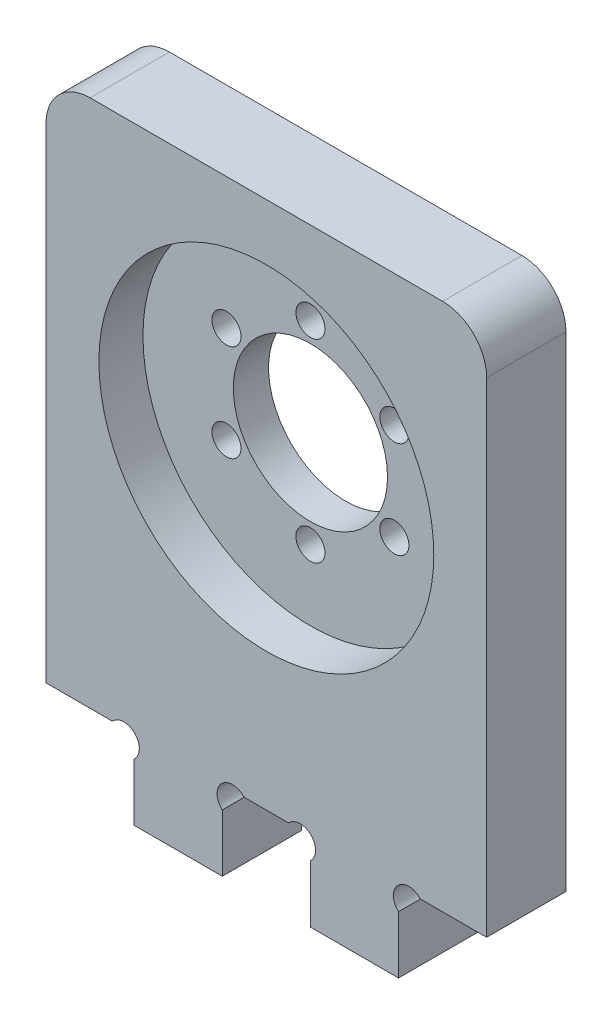
ISO-10303-21;
HEADER;
FILE_DESCRIPTION(('STEP AP214'),'2;1');
FILE_NAME('part.step','',(''),(''),'','','');
FILE_SCHEMA(('AUTOMOTIVE_DESIGN { 1 0 10303 214 1 1 1 1 }'));
ENDSEC;
DATA;
#1=APPLICATION_CONTEXT('core data for automotive mechanical design processes');
#2=APPLICATION_PROTOCOL_DEFINITION('international standard','automotive_design',2000,#1);
#3=PRODUCT_CONTEXT('',#1,'mechanical');
#4=PRODUCT('Part','Part','',(#3));
#5=PRODUCT_RELATED_PRODUCT_CATEGORY('part','',(#4));
#6=PRODUCT_DEFINITION_FORMATION('','',#4);
#7=PRODUCT_DEFINITION_CONTEXT('part definition',#1,'design');
#8=PRODUCT_DEFINITION('design','',#6,#7);
#9=PRODUCT_DEFINITION_SHAPE('','',#8);
#10=(LENGTH_UNIT() NAMED_UNIT(*) SI_UNIT(.MILLI.,.METRE.));
#11=(NAMED_UNIT(*) PLANE_ANGLE_UNIT() SI_UNIT($,.RADIAN.));
#12=(NAMED_UNIT(*) SI_UNIT($,.STERADIAN.) SOLID_ANGLE_UNIT());
#13=UNCERTAINTY_MEASURE_WITH_UNIT(LENGTH_MEASURE(1.E-05),#10,'distance_accuracy_value','');
#14=(GEOMETRIC_REPRESENTATION_CONTEXT(3) GLOBAL_UNCERTAINTY_ASSIGNED_CONTEXT((#13)) GLOBAL_UNIT_ASSIGNED_CONTEXT((#10,
#11,#12)) REPRESENTATION_CONTEXT('',''));
#15=CARTESIAN_POINT('',(0.,0.,0.));
#16=DIRECTION('',(0.,0.,1.));
#17=DIRECTION('',(1.,0.,0.));
#18=AXIS2_PLACEMENT_3D('',#15,#16,#17);
#19=CARTESIAN_POINT('',(25.,34.6,0.));
#20=DIRECTION('',(0.,0.,1.));
#21=DIRECTION('',(1.,0.,0.));
#22=AXIS2_PLACEMENT_3D('',#19,#20,#21);
#23=CYLINDRICAL_SURFACE('',#22,8.75);
#24=CARTESIAN_POINT('',(25.,34.6,0.));
#25=DIRECTION('',(0.,0.,1.));
#26=DIRECTION('',(1.,0.,0.));
#27=AXIS2_PLACEMENT_3D('',#24,#25,#26);
#28=CIRCLE('',#27,8.75);
#29=CARTESIAN_POINT('',(33.75,34.6,0.));
#30=VERTEX_POINT('',#29);
#31=EDGE_CURVE('E190',#30,#30,#28,.T.);
#32=ORIENTED_EDGE('',*,*,#31,.F.);
#33=EDGE_LOOP('',(#32));
#34=FACE_BOUND('',#33,.T.);
#35=CARTESIAN_POINT('',(25.,34.6,4.));
#36=DIRECTION('',(0.,0.,1.));
#37=DIRECTION('',(1.,0.,0.));
#38=AXIS2_PLACEMENT_3D('',#35,#36,#37);
#39=CIRCLE('',#38,8.75);
#40=CARTESIAN_POINT('',(33.75,34.6,4.));
#41=VERTEX_POINT('',#40);
#42=EDGE_CURVE('E309',#41,#41,#39,.F.);
#43=ORIENTED_EDGE('',*,*,#42,.F.);
#44=EDGE_LOOP('',(#43));
#45=FACE_BOUND('',#44,.T.);
#46=ADVANCED_FACE('F33',(#34,#45),#23,.F.);
#47=CARTESIAN_POINT('',(25.,45.6,0.));
#48=DIRECTION('',(0.,0.,1.));
#49=DIRECTION('',(1.,0.,0.));
#50=AXIS2_PLACEMENT_3D('',#47,#48,#49);
#51=CYLINDRICAL_SURFACE('',#50,1.65);
#52=CARTESIAN_POINT('',(25.,45.6,0.));
#53=DIRECTION('',(0.,0.,1.));
#54=DIRECTION('',(1.,0.,0.));
#55=AXIS2_PLACEMENT_3D('',#52,#53,#54);
#56=CIRCLE('',#55,1.65);
#57=CARTESIAN_POINT('',(26.65,45.6,0.));
#58=VERTEX_POINT('',#57);
#59=EDGE_CURVE('E322',#58,#58,#56,.T.);
#60=ORIENTED_EDGE('',*,*,#59,.F.);
#61=EDGE_LOOP('',(#60));
#62=FACE_BOUND('',#61,.T.);
#63=CARTESIAN_POINT('',(25.,45.6,4.));
#64=DIRECTION('',(0.,0.,1.));
#65=DIRECTION('',(1.,0.,0.));
#66=AXIS2_PLACEMENT_3D('',#63,#64,#65);
#67=CIRCLE('',#66,1.65);
#68=CARTESIAN_POINT('',(26.65,45.6,4.));
#69=VERTEX_POINT('',#68);
#70=EDGE_CURVE('E306',#69,#69,#67,.F.);
#71=ORIENTED_EDGE('',*,*,#70,.F.);
#72=EDGE_LOOP('',(#71));
#73=FACE_BOUND('',#72,.T.);
#74=ADVANCED_FACE('F353',(#62,#73),#51,.F.);
#75=CARTESIAN_POINT('',(34.5262794416288,40.1,0.));
#76=DIRECTION('',(0.,0.,1.));
#77=DIRECTION('',(1.,0.,0.));
#78=AXIS2_PLACEMENT_3D('',#75,#76,#77);
#79=CYLINDRICAL_SURFACE('',#78,1.65);
#80=CARTESIAN_POINT('',(34.5262794416288,40.1,0.));
#81=DIRECTION('',(0.,0.,1.));
#82=DIRECTION('',(1.,0.,0.));
#83=AXIS2_PLACEMENT_3D('',#80,#81,#82);
#84=CIRCLE('',#83,1.65);
#85=CARTESIAN_POINT('',(36.1762794416288,40.1,0.));
#86=VERTEX_POINT('',#85);
#87=EDGE_CURVE('E325',#86,#86,#84,.T.);
#88=ORIENTED_EDGE('',*,*,#87,.F.);
#89=EDGE_LOOP('',(#88));
#90=FACE_BOUND('',#89,.T.);
#91=CARTESIAN_POINT('',(34.5262794416288,40.1,4.));
#92=DIRECTION('',(0.,0.,1.));
#93=DIRECTION('',(1.,0.,0.));
#94=AXIS2_PLACEMENT_3D('',#91,#92,#93);
#95=CIRCLE('',#94,1.65);
#96=CARTESIAN_POINT('',(36.1762794416288,40.1,4.));
#97=VERTEX_POINT('',#96);
#98=EDGE_CURVE('E303',#97,#97,#95,.F.);
#99=ORIENTED_EDGE('',*,*,#98,.F.);
#100=EDGE_LOOP('',(#99));
#101=FACE_BOUND('',#100,.T.);
#102=ADVANCED_FACE('F336',(#90,#101),#79,.F.);
#103=CARTESIAN_POINT('',(34.5262794416288,29.1,0.));
#104=DIRECTION('',(0.,0.,1.));
#105=DIRECTION('',(1.,0.,0.));
#106=AXIS2_PLACEMENT_3D('',#103,#104,#105);
#107=CYLINDRICAL_SURFACE('',#106,1.65);
#108=CARTESIAN_POINT('',(34.5262794416288,29.1,0.));
#109=DIRECTION('',(0.,0.,1.));
#110=DIRECTION('',(1.,0.,0.));
#111=AXIS2_PLACEMENT_3D('',#108,#109,#110);
#112=CIRCLE('',#111,1.65);
#113=CARTESIAN_POINT('',(36.1762794416288,29.1,0.));
#114=VERTEX_POINT('',#113);
#115=EDGE_CURVE('E316',#114,#114,#112,.T.);
#116=ORIENTED_EDGE('',*,*,#115,.F.);
#117=EDGE_LOOP('',(#116));
#118=FACE_BOUND('',#117,.T.);
#119=CARTESIAN_POINT('',(34.5262794416288,29.1,4.));
#120=DIRECTION('',(0.,0.,1.));
#121=DIRECTION('',(1.,0.,0.));
#122=AXIS2_PLACEMENT_3D('',#119,#120,#121);
#123=CIRCLE('',#122,1.65);
#124=CARTESIAN_POINT('',(36.1762794416288,29.1,4.));
#125=VERTEX_POINT('',#124);
#126=EDGE_CURVE('E300',#125,#125,#123,.F.);
#127=ORIENTED_EDGE('',*,*,#126,.F.);
#128=EDGE_LOOP('',(#127));
#129=FACE_BOUND('',#128,.T.);
#130=ADVANCED_FACE('F332',(#118,#129),#107,.F.);
#131=CARTESIAN_POINT('',(25.,23.6,0.));
#132=DIRECTION('',(0.,0.,1.));
#133=DIRECTION('',(1.,0.,0.));
#134=AXIS2_PLACEMENT_3D('',#131,#132,#133);
#135=CYLINDRICAL_SURFACE('',#134,1.65);
#136=CARTESIAN_POINT('',(25.,23.6,0.));
#137=DIRECTION('',(0.,0.,1.));
#138=DIRECTION('',(1.,0.,0.));
#139=AXIS2_PLACEMENT_3D('',#136,#137,#138);
#140=CIRCLE('',#139,1.65);
#141=CARTESIAN_POINT('',(26.65,23.6,0.));
#142=VERTEX_POINT('',#141);
#143=EDGE_CURVE('E313',#142,#142,#140,.T.);
#144=ORIENTED_EDGE('',*,*,#143,.F.);
#145=EDGE_LOOP('',(#144));
#146=FACE_BOUND('',#145,.T.);
#147=CARTESIAN_POINT('',(25.,23.6,4.));
#148=DIRECTION('',(0.,0.,1.));
#149=DIRECTION('',(1.,0.,0.));
#150=AXIS2_PLACEMENT_3D('',#147,#148,#149);
#151=CIRCLE('',#150,1.65);
#152=CARTESIAN_POINT('',(26.65,23.6,4.));
#153=VERTEX_POINT('',#152);
#154=EDGE_CURVE('E297',#153,#153,#151,.F.);
#155=ORIENTED_EDGE('',*,*,#154,.F.);
#156=EDGE_LOOP('',(#155));
#157=FACE_BOUND('',#156,.T.);
#158=ADVANCED_FACE('F335',(#146,#157),#135,.F.);
#159=CARTESIAN_POINT('',(15.4737205583712,29.1,0.));
#160=DIRECTION('',(0.,0.,1.));
#161=DIRECTION('',(1.,0.,0.));
#162=AXIS2_PLACEMENT_3D('',#159,#160,#161);
#163=CYLINDRICAL_SURFACE('',#162,1.65);
#164=CARTESIAN_POINT('',(15.4737205583712,29.1,0.));
#165=DIRECTION('',(0.,0.,1.));
#166=DIRECTION('',(1.,0.,0.));
#167=AXIS2_PLACEMENT_3D('',#164,#165,#166);
#168=CIRCLE('',#167,1.65);
#169=CARTESIAN_POINT('',(17.1237205583712,29.1,0.));
#170=VERTEX_POINT('',#169);
#171=EDGE_CURVE('E317',#170,#170,#168,.T.);
#172=ORIENTED_EDGE('',*,*,#171,.F.);
#173=EDGE_LOOP('',(#172));
#174=FACE_BOUND('',#173,.T.);
#175=CARTESIAN_POINT('',(15.4737205583712,29.1,4.));
#176=DIRECTION('',(0.,0.,1.));
#177=DIRECTION('',(1.,0.,0.));
#178=AXIS2_PLACEMENT_3D('',#175,#176,#177);
#179=CIRCLE('',#178,1.65);
#180=CARTESIAN_POINT('',(17.1237205583712,29.1,4.));
#181=VERTEX_POINT('',#180);
#182=EDGE_CURVE('E257',#181,#181,#179,.F.);
#183=ORIENTED_EDGE('',*,*,#182,.F.);
#184=EDGE_LOOP('',(#183));
#185=FACE_BOUND('',#184,.T.);
#186=ADVANCED_FACE('F485',(#174,#185),#163,.F.);
#187=CARTESIAN_POINT('',(15.4737205583712,40.1,0.));
#188=DIRECTION('',(0.,0.,1.));
#189=DIRECTION('',(1.,0.,0.));
#190=AXIS2_PLACEMENT_3D('',#187,#188,#189);
#191=CYLINDRICAL_SURFACE('',#190,1.65);
#192=CARTESIAN_POINT('',(15.4737205583712,40.1,0.));
#193=DIRECTION('',(0.,0.,1.));
#194=DIRECTION('',(1.,0.,0.));
#195=AXIS2_PLACEMENT_3D('',#192,#193,#194);
#196=CIRCLE('',#195,1.65);
#197=CARTESIAN_POINT('',(17.1237205583712,40.1,0.));
#198=VERTEX_POINT('',#197);
#199=EDGE_CURVE('E312',#198,#198,#196,.T.);
#200=ORIENTED_EDGE('',*,*,#199,.F.);
#201=EDGE_LOOP('',(#200));
#202=FACE_BOUND('',#201,.T.);
#203=CARTESIAN_POINT('',(15.4737205583712,40.1,4.));
#204=DIRECTION('',(0.,0.,1.));
#205=DIRECTION('',(1.,0.,0.));
#206=AXIS2_PLACEMENT_3D('',#203,#204,#205);
#207=CIRCLE('',#206,1.65);
#208=CARTESIAN_POINT('',(17.1237205583712,40.1,4.));
#209=VERTEX_POINT('',#208);
#210=EDGE_CURVE('E254',#209,#209,#207,.F.);
#211=ORIENTED_EDGE('',*,*,#210,.F.);
#212=EDGE_LOOP('',(#211));
#213=FACE_BOUND('',#212,.T.);
#214=ADVANCED_FACE('F489',(#202,#213),#191,.F.);
#215=CARTESIAN_POINT('',(0.,0.,9.));
#216=DIRECTION('',(0.,1.,0.));
#217=DIRECTION('',(0.,0.,1.));
#218=AXIS2_PLACEMENT_3D('',#215,#216,#217);
#219=PLANE('',#218);
#220=DIRECTION('',(1.,0.,0.));
#221=VECTOR('',#220,1.);
#222=CARTESIAN_POINT('',(0.,0.,9.));
#223=LINE('',#222,#221);
#224=CARTESIAN_POINT('',(22.4748737341529,0.,9.));
#225=VERTEX_POINT('',#224);
#226=CARTESIAN_POINT('',(27.5251262658471,0.,9.));
#227=VERTEX_POINT('',#226);
#228=EDGE_CURVE('E228',#225,#227,#223,.T.);
#229=ORIENTED_EDGE('',*,*,#228,.F.);
#230=DIRECTION('',(0.,0.,1.));
#231=VECTOR('',#230,1.);
#232=CARTESIAN_POINT('',(22.4748737341529,0.,0.));
#233=LINE('',#232,#231);
#234=CARTESIAN_POINT('',(22.4748737341529,0.,0.));
#235=VERTEX_POINT('',#234);
#236=EDGE_CURVE('E287',#235,#225,#233,.T.);
#237=ORIENTED_EDGE('',*,*,#236,.F.);
#238=DIRECTION('',(1.,0.,0.));
#239=VECTOR('',#238,1.);
#240=CARTESIAN_POINT('',(0.,0.,0.));
#241=LINE('',#240,#239);
#242=CARTESIAN_POINT('',(27.5251262658471,0.,0.));
#243=VERTEX_POINT('',#242);
#244=EDGE_CURVE('E243',#235,#243,#241,.T.);
#245=ORIENTED_EDGE('',*,*,#244,.T.);
#246=DIRECTION('',(0.,0.,1.));
#247=VECTOR('',#246,1.);
#248=CARTESIAN_POINT('',(27.5251262658471,0.,0.));
#249=LINE('',#248,#247);
#250=EDGE_CURVE('E280',#243,#227,#249,.T.);
#251=ORIENTED_EDGE('',*,*,#250,.T.);
#252=EDGE_LOOP('',(#229,#237,#245,#251));
#253=FACE_BOUND('',#252,.T.);
#254=ADVANCED_FACE('F406',(#253),#219,.F.);
#255=CARTESIAN_POINT('',(42.4748737341529,0.,9.));
#256=VERTEX_POINT('',#255);
#257=CARTESIAN_POINT('',(50.,0.,9.));
#258=VERTEX_POINT('',#257);
#259=EDGE_CURVE('E226',#256,#258,#223,.T.);
#260=ORIENTED_EDGE('',*,*,#259,.F.);
#261=DIRECTION('',(0.,0.,1.));
#262=VECTOR('',#261,1.);
#263=CARTESIAN_POINT('',(42.4748737341529,0.,0.));
#264=LINE('',#263,#262);
#265=CARTESIAN_POINT('',(42.4748737341529,0.,0.));
#266=VERTEX_POINT('',#265);
#267=EDGE_CURVE('E460',#266,#256,#264,.T.);
#268=ORIENTED_EDGE('',*,*,#267,.F.);
#269=CARTESIAN_POINT('',(50.,0.,0.));
#270=VERTEX_POINT('',#269);
#271=EDGE_CURVE('E239',#266,#270,#241,.T.);
#272=ORIENTED_EDGE('',*,*,#271,.T.);
#273=DIRECTION('',(0.,0.,-1.));
#274=VECTOR('',#273,1.);
#275=CARTESIAN_POINT('',(50.,0.,9.));
#276=LINE('',#275,#274);
#277=EDGE_CURVE('E237',#258,#270,#276,.T.);
#278=ORIENTED_EDGE('',*,*,#277,.F.);
#279=EDGE_LOOP('',(#260,#268,#272,#278));
#280=FACE_BOUND('',#279,.T.);
#281=ADVANCED_FACE('F407',(#280),#219,.F.);
#282=CARTESIAN_POINT('',(0.,0.,9.));
#283=DIRECTION('',(1.,0.,0.));
#284=DIRECTION('',(0.,0.,-1.));
#285=AXIS2_PLACEMENT_3D('',#282,#283,#284);
#286=PLANE('',#285);
#287=DIRECTION('',(0.,-1.,0.));
#288=VECTOR('',#287,1.);
#289=CARTESIAN_POINT('',(0.,0.,9.));
#290=LINE('',#289,#288);
#291=CARTESIAN_POINT('',(0.,55.,9.));
#292=VERTEX_POINT('',#291);
#293=CARTESIAN_POINT('',(0.,0.,9.));
#294=VERTEX_POINT('',#293);
#295=EDGE_CURVE('E224',#292,#294,#290,.T.);
#296=ORIENTED_EDGE('',*,*,#295,.F.);
#297=DIRECTION('',(0.,0.,-1.));
#298=VECTOR('',#297,1.);
#299=CARTESIAN_POINT('',(0.,55.,9.));
#300=LINE('',#299,#298);
#301=CARTESIAN_POINT('',(0.,55.,0.));
#302=VERTEX_POINT('',#301);
#303=EDGE_CURVE('E11',#292,#302,#300,.T.);
#304=ORIENTED_EDGE('',*,*,#303,.T.);
#305=DIRECTION('',(0.,-1.,0.));
#306=VECTOR('',#305,1.);
#307=CARTESIAN_POINT('',(0.,0.,0.));
#308=LINE('',#307,#306);
#309=CARTESIAN_POINT('',(0.,0.,0.));
#310=VERTEX_POINT('',#309);
#311=EDGE_CURVE('E221',#302,#310,#308,.T.);
#312=ORIENTED_EDGE('',*,*,#311,.T.);
#313=DIRECTION('',(0.,0.,-1.));
#314=VECTOR('',#313,1.);
#315=CARTESIAN_POINT('',(0.,0.,9.));
#316=LINE('',#315,#314);
#317=EDGE_CURVE('E250',#294,#310,#316,.T.);
#318=ORIENTED_EDGE('',*,*,#317,.F.);
#319=EDGE_LOOP('',(#296,#304,#312,#318));
#320=FACE_BOUND('',#319,.T.);
#321=ADVANCED_FACE('F404',(#320),#286,.F.);
#322=CARTESIAN_POINT('',(7.52512626584709,0.,0.));
#323=VERTEX_POINT('',#322);
#324=EDGE_CURVE('E240',#310,#323,#241,.T.);
#325=ORIENTED_EDGE('',*,*,#324,.T.);
#326=DIRECTION('',(0.,0.,1.));
#327=VECTOR('',#326,1.);
#328=CARTESIAN_POINT('',(7.52512626584709,0.,0.));
#329=LINE('',#328,#327);
#330=CARTESIAN_POINT('',(7.5251262658471,0.,9.));
#331=VERTEX_POINT('',#330);
#332=EDGE_CURVE('E161',#323,#331,#329,.T.);
#333=ORIENTED_EDGE('',*,*,#332,.T.);
#334=EDGE_CURVE('E230',#294,#331,#223,.T.);
#335=ORIENTED_EDGE('',*,*,#334,.F.);
#336=ORIENTED_EDGE('',*,*,#317,.T.);
#337=EDGE_LOOP('',(#325,#333,#335,#336));
#338=FACE_BOUND('',#337,.T.);
#339=ADVANCED_FACE('F400',(#338),#219,.F.);
#340=CARTESIAN_POINT('',(50.,0.,9.));
#341=DIRECTION('',(-1.,0.,0.));
#342=DIRECTION('',(0.,0.,1.));
#343=AXIS2_PLACEMENT_3D('',#340,#341,#342);
#344=PLANE('',#343);
#345=DIRECTION('',(0.,1.,0.));
#346=VECTOR('',#345,1.);
#347=CARTESIAN_POINT('',(50.,0.,0.));
#348=LINE('',#347,#346);
#349=CARTESIAN_POINT('',(50.,55.,0.));
#350=VERTEX_POINT('',#349);
#351=EDGE_CURVE('E242',#270,#350,#348,.T.);
#352=ORIENTED_EDGE('',*,*,#351,.T.);
#353=DIRECTION('',(0.,0.,-1.));
#354=VECTOR('',#353,1.);
#355=CARTESIAN_POINT('',(50.,55.,9.));
#356=LINE('',#355,#354);
#357=CARTESIAN_POINT('',(50.,55.,9.));
#358=VERTEX_POINT('',#357);
#359=EDGE_CURVE('E267',#350,#358,#356,.F.);
#360=ORIENTED_EDGE('',*,*,#359,.T.);
#361=DIRECTION('',(0.,1.,0.));
#362=VECTOR('',#361,1.);
#363=CARTESIAN_POINT('',(50.,0.,9.));
#364=LINE('',#363,#362);
#365=EDGE_CURVE('E231',#258,#358,#364,.T.);
#366=ORIENTED_EDGE('',*,*,#365,.F.);
#367=ORIENTED_EDGE('',*,*,#277,.T.);
#368=EDGE_LOOP('',(#352,#360,#366,#367));
#369=FACE_BOUND('',#368,.T.);
#370=ADVANCED_FACE('F396',(#369),#344,.F.);
#371=CARTESIAN_POINT('',(0.,60.,9.));
#372=DIRECTION('',(0.,-1.,0.));
#373=DIRECTION('',(0.,0.,-1.));
#374=AXIS2_PLACEMENT_3D('',#371,#372,#373);
#375=PLANE('',#374);
#376=DIRECTION('',(-1.,0.,0.));
#377=VECTOR('',#376,1.);
#378=CARTESIAN_POINT('',(0.,60.,9.));
#379=LINE('',#378,#377);
#380=CARTESIAN_POINT('',(45.,60.,9.));
#381=VERTEX_POINT('',#380);
#382=CARTESIAN_POINT('',(5.,60.,9.));
#383=VERTEX_POINT('',#382);
#384=EDGE_CURVE('E234',#381,#383,#379,.T.);
#385=ORIENTED_EDGE('',*,*,#384,.F.);
#386=DIRECTION('',(0.,0.,-1.));
#387=VECTOR('',#386,1.);
#388=CARTESIAN_POINT('',(45.,60.,9.));
#389=LINE('',#388,#387);
#390=CARTESIAN_POINT('',(45.,60.,0.));
#391=VERTEX_POINT('',#390);
#392=EDGE_CURVE('E260',#381,#391,#389,.T.);
#393=ORIENTED_EDGE('',*,*,#392,.T.);
#394=DIRECTION('',(-1.,0.,0.));
#395=VECTOR('',#394,1.);
#396=CARTESIAN_POINT('',(0.,60.,0.));
#397=LINE('',#396,#395);
#398=CARTESIAN_POINT('',(5.,60.,0.));
#399=VERTEX_POINT('',#398);
#400=EDGE_CURVE('E227',#391,#399,#397,.T.);
#401=ORIENTED_EDGE('',*,*,#400,.T.);
#402=DIRECTION('',(0.,0.,-1.));
#403=VECTOR('',#402,1.);
#404=CARTESIAN_POINT('',(5.,60.,9.));
#405=LINE('',#404,#403);
#406=EDGE_CURVE('E253',#399,#383,#405,.F.);
#407=ORIENTED_EDGE('',*,*,#406,.T.);
#408=EDGE_LOOP('',(#385,#393,#401,#407));
#409=FACE_BOUND('',#408,.T.);
#410=ADVANCED_FACE('F390',(#409),#375,.F.);
#411=CARTESIAN_POINT('',(0.,0.,9.));
#412=DIRECTION('',(0.,0.,-1.));
#413=DIRECTION('',(-1.,0.,0.));
#414=AXIS2_PLACEMENT_3D('',#411,#412,#413);
#415=PLANE('',#414);
#416=CARTESIAN_POINT('',(25.,34.6,9.));
#417=DIRECTION('',(0.,0.,1.));
#418=DIRECTION('',(1.,0.,0.));
#419=AXIS2_PLACEMENT_3D('',#416,#417,#418);
#420=CIRCLE('',#419,19.);
#421=CARTESIAN_POINT('',(44.,34.6,9.));
#422=VERTEX_POINT('',#421);
#423=EDGE_CURVE('E275',#422,#422,#420,.T.);
#424=ORIENTED_EDGE('',*,*,#423,.F.);
#425=EDGE_LOOP('',(#424));
#426=FACE_BOUND('',#425,.T.);
#427=ORIENTED_EDGE('',*,*,#334,.T.);
#428=CARTESIAN_POINT('',(8.8313627116336,-1.16863728836642,9.));
#429=DIRECTION('',(0.,0.,1.));
#430=DIRECTION('',(1.,0.,0.));
#431=AXIS2_PLACEMENT_3D('',#428,#429,#430);
#432=CIRCLE('',#431,1.7527027027027);
#433=CARTESIAN_POINT('',(10.,-2.47487373415292,9.));
#434=VERTEX_POINT('',#433);
#435=EDGE_CURVE('E37',#434,#331,#432,.T.);
#436=ORIENTED_EDGE('',*,*,#435,.F.);
#437=DIRECTION('',(0.,-1.,0.));
#438=VECTOR('',#437,1.);
#439=CARTESIAN_POINT('',(10.,0.,9.));
#440=LINE('',#439,#438);
#441=CARTESIAN_POINT('',(10.,-9.,9.));
#442=VERTEX_POINT('',#441);
#443=EDGE_CURVE('E173',#434,#442,#440,.T.);
#444=ORIENTED_EDGE('',*,*,#443,.T.);
#445=DIRECTION('',(1.,0.,0.));
#446=VECTOR('',#445,1.);
#447=CARTESIAN_POINT('',(20.,-9.,9.));
#448=LINE('',#447,#446);
#449=CARTESIAN_POINT('',(20.,-9.,9.));
#450=VERTEX_POINT('',#449);
#451=EDGE_CURVE('E187',#442,#450,#448,.T.);
#452=ORIENTED_EDGE('',*,*,#451,.T.);
#453=DIRECTION('',(0.,1.,0.));
#454=VECTOR('',#453,1.);
#455=CARTESIAN_POINT('',(20.,0.,9.));
#456=LINE('',#455,#454);
#457=CARTESIAN_POINT('',(20.,-2.47487373415292,9.));
#458=VERTEX_POINT('',#457);
#459=EDGE_CURVE('E182',#450,#458,#456,.T.);
#460=ORIENTED_EDGE('',*,*,#459,.T.);
#461=CARTESIAN_POINT('',(21.1686372883664,-1.16863728836642,9.));
#462=DIRECTION('',(0.,0.,1.));
#463=DIRECTION('',(1.,0.,0.));
#464=AXIS2_PLACEMENT_3D('',#461,#462,#463);
#465=CIRCLE('',#464,1.7527027027027);
#466=EDGE_CURVE('E277',#225,#458,#465,.T.);
#467=ORIENTED_EDGE('',*,*,#466,.F.);
#468=ORIENTED_EDGE('',*,*,#228,.T.);
#469=CARTESIAN_POINT('',(28.8313627116336,-1.16863728836642,9.));
#470=DIRECTION('',(0.,0.,1.));
#471=DIRECTION('',(1.,0.,0.));
#472=AXIS2_PLACEMENT_3D('',#469,#470,#471);
#473=CIRCLE('',#472,1.7527027027027);
#474=CARTESIAN_POINT('',(30.,-2.47487373415292,9.));
#475=VERTEX_POINT('',#474);
#476=EDGE_CURVE('E272',#475,#227,#473,.T.);
#477=ORIENTED_EDGE('',*,*,#476,.F.);
#478=DIRECTION('',(0.,-1.,0.));
#479=VECTOR('',#478,1.);
#480=CARTESIAN_POINT('',(30.,0.,9.));
#481=LINE('',#480,#479);
#482=CARTESIAN_POINT('',(30.,-9.,9.));
#483=VERTEX_POINT('',#482);
#484=EDGE_CURVE('E201',#475,#483,#481,.T.);
#485=ORIENTED_EDGE('',*,*,#484,.T.);
#486=DIRECTION('',(1.,0.,0.));
#487=VECTOR('',#486,1.);
#488=CARTESIAN_POINT('',(30.,-9.,9.));
#489=LINE('',#488,#487);
#490=CARTESIAN_POINT('',(40.,-9.,9.));
#491=VERTEX_POINT('',#490);
#492=EDGE_CURVE('E214',#483,#491,#489,.T.);
#493=ORIENTED_EDGE('',*,*,#492,.T.);
#494=DIRECTION('',(0.,1.,0.));
#495=VECTOR('',#494,1.);
#496=CARTESIAN_POINT('',(40.,0.,9.));
#497=LINE('',#496,#495);
#498=CARTESIAN_POINT('',(40.,-2.47487373415292,9.));
#499=VERTEX_POINT('',#498);
#500=EDGE_CURVE('E206',#491,#499,#497,.T.);
#501=ORIENTED_EDGE('',*,*,#500,.T.);
#502=CARTESIAN_POINT('',(41.1686372883664,-1.16863728836642,9.));
#503=DIRECTION('',(0.,0.,1.));
#504=DIRECTION('',(1.,0.,0.));
#505=AXIS2_PLACEMENT_3D('',#502,#503,#504);
#506=CIRCLE('',#505,1.7527027027027);
#507=EDGE_CURVE('E52',#256,#499,#506,.T.);
#508=ORIENTED_EDGE('',*,*,#507,.F.);
#509=ORIENTED_EDGE('',*,*,#259,.T.);
#510=ORIENTED_EDGE('',*,*,#365,.T.);
#511=CARTESIAN_POINT('',(45.,55.,9.));
#512=DIRECTION('',(0.,0.,-1.));
#513=DIRECTION('',(-1.,0.,0.));
#514=AXIS2_PLACEMENT_3D('',#511,#512,#513);
#515=CIRCLE('',#514,5.);
#516=EDGE_CURVE('E43',#358,#381,#515,.F.);
#517=ORIENTED_EDGE('',*,*,#516,.T.);
#518=ORIENTED_EDGE('',*,*,#384,.T.);
#519=CARTESIAN_POINT('',(5.,55.,9.));
#520=DIRECTION('',(0.,0.,-1.));
#521=DIRECTION('',(-1.,0.,0.));
#522=AXIS2_PLACEMENT_3D('',#519,#520,#521);
#523=CIRCLE('',#522,5.);
#524=EDGE_CURVE('E269',#383,#292,#523,.F.);
#525=ORIENTED_EDGE('',*,*,#524,.T.);
#526=ORIENTED_EDGE('',*,*,#295,.T.);
#527=EDGE_LOOP('',(#427,#436,#444,#452,#460,#467,#468,#477,#485,#493,#501,#508,#509,#510,#517,
#518,#525,#526));
#528=FACE_BOUND('',#527,.T.);
#529=ADVANCED_FACE('F387',(#426,#528),#415,.F.);
#530=CARTESIAN_POINT('',(0.,0.,0.));
#531=DIRECTION('',(0.,0.,-1.));
#532=DIRECTION('',(-1.,0.,0.));
#533=AXIS2_PLACEMENT_3D('',#530,#531,#532);
#534=PLANE('',#533);
#535=CARTESIAN_POINT('',(8.8313627116336,-1.16863728836642,0.));
#536=DIRECTION('',(0.,0.,1.));
#537=DIRECTION('',(-1.,0.,0.));
#538=AXIS2_PLACEMENT_3D('',#535,#536,#537);
#539=CIRCLE('',#538,1.7527027027027);
#540=CARTESIAN_POINT('',(10.,-2.47487373415292,0.));
#541=VERTEX_POINT('',#540);
#542=EDGE_CURVE('E158',#541,#323,#539,.T.);
#543=ORIENTED_EDGE('',*,*,#542,.T.);
#544=ORIENTED_EDGE('',*,*,#324,.F.);
#545=ORIENTED_EDGE('',*,*,#311,.F.);
#546=CARTESIAN_POINT('',(5.,55.,0.));
#547=DIRECTION('',(0.,0.,-1.));
#548=DIRECTION('',(-1.,0.,0.));
#549=AXIS2_PLACEMENT_3D('',#546,#547,#548);
#550=CIRCLE('',#549,5.);
#551=EDGE_CURVE('E263',#302,#399,#550,.T.);
#552=ORIENTED_EDGE('',*,*,#551,.T.);
#553=ORIENTED_EDGE('',*,*,#400,.F.);
#554=CARTESIAN_POINT('',(45.,55.,0.));
#555=DIRECTION('',(0.,0.,-1.));
#556=DIRECTION('',(-1.,0.,0.));
#557=AXIS2_PLACEMENT_3D('',#554,#555,#556);
#558=CIRCLE('',#557,5.);
#559=EDGE_CURVE('E265',#391,#350,#558,.T.);
#560=ORIENTED_EDGE('',*,*,#559,.T.);
#561=ORIENTED_EDGE('',*,*,#351,.F.);
#562=ORIENTED_EDGE('',*,*,#271,.F.);
#563=CARTESIAN_POINT('',(41.1686372883664,-1.16863728836642,0.));
#564=DIRECTION('',(0.,0.,1.));
#565=DIRECTION('',(1.,0.,0.));
#566=AXIS2_PLACEMENT_3D('',#563,#564,#565);
#567=CIRCLE('',#566,1.7527027027027);
#568=CARTESIAN_POINT('',(40.,-2.47487373415292,0.));
#569=VERTEX_POINT('',#568);
#570=EDGE_CURVE('E174',#266,#569,#567,.T.);
#571=ORIENTED_EDGE('',*,*,#570,.T.);
#572=DIRECTION('',(0.,1.,0.));
#573=VECTOR('',#572,1.);
#574=CARTESIAN_POINT('',(40.,0.,0.));
#575=LINE('',#574,#573);
#576=CARTESIAN_POINT('',(40.,-9.,0.));
#577=VERTEX_POINT('',#576);
#578=EDGE_CURVE('E209',#577,#569,#575,.T.);
#579=ORIENTED_EDGE('',*,*,#578,.F.);
#580=DIRECTION('',(1.,0.,0.));
#581=VECTOR('',#580,1.);
#582=CARTESIAN_POINT('',(30.,-9.,0.));
#583=LINE('',#582,#581);
#584=CARTESIAN_POINT('',(30.,-9.,0.));
#585=VERTEX_POINT('',#584);
#586=EDGE_CURVE('E205',#585,#577,#583,.T.);
#587=ORIENTED_EDGE('',*,*,#586,.F.);
#588=DIRECTION('',(0.,-1.,0.));
#589=VECTOR('',#588,1.);
#590=CARTESIAN_POINT('',(30.,0.,0.));
#591=LINE('',#590,#589);
#592=CARTESIAN_POINT('',(30.,-2.47487373415292,0.));
#593=VERTEX_POINT('',#592);
#594=EDGE_CURVE('E203',#593,#585,#591,.T.);
#595=ORIENTED_EDGE('',*,*,#594,.F.);
#596=CARTESIAN_POINT('',(28.8313627116336,-1.16863728836642,0.));
#597=DIRECTION('',(0.,0.,1.));
#598=DIRECTION('',(-1.,0.,0.));
#599=AXIS2_PLACEMENT_3D('',#596,#597,#598);
#600=CIRCLE('',#599,1.7527027027027);
#601=EDGE_CURVE('E278',#593,#243,#600,.T.);
#602=ORIENTED_EDGE('',*,*,#601,.T.);
#603=ORIENTED_EDGE('',*,*,#244,.F.);
#604=CARTESIAN_POINT('',(21.1686372883664,-1.16863728836642,0.));
#605=DIRECTION('',(0.,0.,1.));
#606=DIRECTION('',(1.,0.,0.));
#607=AXIS2_PLACEMENT_3D('',#604,#605,#606);
#608=CIRCLE('',#607,1.7527027027027);
#609=CARTESIAN_POINT('',(20.,-2.47487373415292,0.));
#610=VERTEX_POINT('',#609);
#611=EDGE_CURVE('E79',#235,#610,#608,.T.);
#612=ORIENTED_EDGE('',*,*,#611,.T.);
#613=DIRECTION('',(0.,1.,0.));
#614=VECTOR('',#613,1.);
#615=CARTESIAN_POINT('',(20.,0.,0.));
#616=LINE('',#615,#614);
#617=CARTESIAN_POINT('',(20.,-9.,0.));
#618=VERTEX_POINT('',#617);
#619=EDGE_CURVE('E184',#618,#610,#616,.T.);
#620=ORIENTED_EDGE('',*,*,#619,.F.);
#621=DIRECTION('',(1.,0.,0.));
#622=VECTOR('',#621,1.);
#623=CARTESIAN_POINT('',(20.,-9.,0.));
#624=LINE('',#623,#622);
#625=CARTESIAN_POINT('',(10.,-9.,0.));
#626=VERTEX_POINT('',#625);
#627=EDGE_CURVE('E181',#626,#618,#624,.T.);
#628=ORIENTED_EDGE('',*,*,#627,.F.);
#629=DIRECTION('',(0.,-1.,0.));
#630=VECTOR('',#629,1.);
#631=CARTESIAN_POINT('',(10.,0.,0.));
#632=LINE('',#631,#630);
#633=EDGE_CURVE('E171',#541,#626,#632,.T.);
#634=ORIENTED_EDGE('',*,*,#633,.F.);
#635=EDGE_LOOP('',(#543,#544,#545,#552,#553,#560,#561,#562,#571,#579,#587,#595,#602,#603,#612,
#620,#628,#634));
#636=FACE_BOUND('',#635,.T.);
#637=ORIENTED_EDGE('',*,*,#199,.T.);
#638=EDGE_LOOP('',(#637));
#639=FACE_BOUND('',#638,.T.);
#640=ORIENTED_EDGE('',*,*,#171,.T.);
#641=EDGE_LOOP('',(#640));
#642=FACE_BOUND('',#641,.T.);
#643=ORIENTED_EDGE('',*,*,#143,.T.);
#644=EDGE_LOOP('',(#643));
#645=FACE_BOUND('',#644,.T.);
#646=ORIENTED_EDGE('',*,*,#115,.T.);
#647=EDGE_LOOP('',(#646));
#648=FACE_BOUND('',#647,.T.);
#649=ORIENTED_EDGE('',*,*,#87,.T.);
#650=EDGE_LOOP('',(#649));
#651=FACE_BOUND('',#650,.T.);
#652=ORIENTED_EDGE('',*,*,#59,.T.);
#653=EDGE_LOOP('',(#652));
#654=FACE_BOUND('',#653,.T.);
#655=ORIENTED_EDGE('',*,*,#31,.T.);
#656=EDGE_LOOP('',(#655));
#657=FACE_BOUND('',#656,.T.);
#658=ADVANCED_FACE('F177',(#636,#639,#642,#645,#648,#651,#654,#657),#534,.T.);
#659=CARTESIAN_POINT('',(30.,0.,0.));
#660=DIRECTION('',(-1.,0.,0.));
#661=DIRECTION('',(0.,0.,1.));
#662=AXIS2_PLACEMENT_3D('',#659,#660,#661);
#663=PLANE('',#662);
#664=DIRECTION('',(0.,0.,1.));
#665=VECTOR('',#664,1.);
#666=CARTESIAN_POINT('',(30.,-2.47487373415292,0.));
#667=LINE('',#666,#665);
#668=EDGE_CURVE('E276',#593,#475,#667,.T.);
#669=ORIENTED_EDGE('',*,*,#668,.F.);
#670=ORIENTED_EDGE('',*,*,#594,.T.);
#671=DIRECTION('',(0.,0.,1.));
#672=VECTOR('',#671,1.);
#673=CARTESIAN_POINT('',(30.,-9.,0.));
#674=LINE('',#673,#672);
#675=EDGE_CURVE('E212',#585,#483,#674,.T.);
#676=ORIENTED_EDGE('',*,*,#675,.T.);
#677=ORIENTED_EDGE('',*,*,#484,.F.);
#678=EDGE_LOOP('',(#669,#670,#676,#677));
#679=FACE_BOUND('',#678,.T.);
#680=ADVANCED_FACE('F379',(#679),#663,.T.);
#681=CARTESIAN_POINT('',(40.,0.,0.));
#682=DIRECTION('',(1.,0.,0.));
#683=DIRECTION('',(0.,0.,-1.));
#684=AXIS2_PLACEMENT_3D('',#681,#682,#683);
#685=PLANE('',#684);
#686=DIRECTION('',(0.,0.,1.));
#687=VECTOR('',#686,1.);
#688=CARTESIAN_POINT('',(40.,-2.47487373415292,0.));
#689=LINE('',#688,#687);
#690=EDGE_CURVE('E459',#569,#499,#689,.T.);
#691=ORIENTED_EDGE('',*,*,#690,.T.);
#692=ORIENTED_EDGE('',*,*,#500,.F.);
#693=DIRECTION('',(0.,0.,1.));
#694=VECTOR('',#693,1.);
#695=CARTESIAN_POINT('',(40.,-9.,0.));
#696=LINE('',#695,#694);
#697=EDGE_CURVE('E219',#577,#491,#696,.T.);
#698=ORIENTED_EDGE('',*,*,#697,.F.);
#699=ORIENTED_EDGE('',*,*,#578,.T.);
#700=EDGE_LOOP('',(#691,#692,#698,#699));
#701=FACE_BOUND('',#700,.T.);
#702=ADVANCED_FACE('F376',(#701),#685,.T.);
#703=CARTESIAN_POINT('',(30.,-9.,0.));
#704=DIRECTION('',(0.,-1.,0.));
#705=DIRECTION('',(1.,0.,0.));
#706=AXIS2_PLACEMENT_3D('',#703,#704,#705);
#707=PLANE('',#706);
#708=ORIENTED_EDGE('',*,*,#492,.F.);
#709=ORIENTED_EDGE('',*,*,#675,.F.);
#710=ORIENTED_EDGE('',*,*,#586,.T.);
#711=ORIENTED_EDGE('',*,*,#697,.T.);
#712=EDGE_LOOP('',(#708,#709,#710,#711));
#713=FACE_BOUND('',#712,.T.);
#714=ADVANCED_FACE('F369',(#713),#707,.T.);
#715=CARTESIAN_POINT('',(20.,0.,0.));
#716=DIRECTION('',(1.,0.,0.));
#717=DIRECTION('',(0.,0.,-1.));
#718=AXIS2_PLACEMENT_3D('',#715,#716,#717);
#719=PLANE('',#718);
#720=DIRECTION('',(0.,0.,1.));
#721=VECTOR('',#720,1.);
#722=CARTESIAN_POINT('',(20.,-2.47487373415292,0.));
#723=LINE('',#722,#721);
#724=EDGE_CURVE('E466',#610,#458,#723,.T.);
#725=ORIENTED_EDGE('',*,*,#724,.T.);
#726=ORIENTED_EDGE('',*,*,#459,.F.);
#727=DIRECTION('',(0.,0.,1.));
#728=VECTOR('',#727,1.);
#729=CARTESIAN_POINT('',(20.,-9.,0.));
#730=LINE('',#729,#728);
#731=EDGE_CURVE('E199',#618,#450,#730,.T.);
#732=ORIENTED_EDGE('',*,*,#731,.F.);
#733=ORIENTED_EDGE('',*,*,#619,.T.);
#734=EDGE_LOOP('',(#725,#726,#732,#733));
#735=FACE_BOUND('',#734,.T.);
#736=ADVANCED_FACE('F365',(#735),#719,.T.);
#737=CARTESIAN_POINT('',(20.,-9.,0.));
#738=DIRECTION('',(0.,-1.,0.));
#739=DIRECTION('',(1.,0.,0.));
#740=AXIS2_PLACEMENT_3D('',#737,#738,#739);
#741=PLANE('',#740);
#742=ORIENTED_EDGE('',*,*,#451,.F.);
#743=DIRECTION('',(0.,0.,1.));
#744=VECTOR('',#743,1.);
#745=CARTESIAN_POINT('',(10.,-9.,0.));
#746=LINE('',#745,#744);
#747=EDGE_CURVE('E195',#626,#442,#746,.T.);
#748=ORIENTED_EDGE('',*,*,#747,.F.);
#749=ORIENTED_EDGE('',*,*,#627,.T.);
#750=ORIENTED_EDGE('',*,*,#731,.T.);
#751=EDGE_LOOP('',(#742,#748,#749,#750));
#752=FACE_BOUND('',#751,.T.);
#753=ADVANCED_FACE('F368',(#752),#741,.T.);
#754=CARTESIAN_POINT('',(10.,0.,0.));
#755=DIRECTION('',(-1.,0.,0.));
#756=DIRECTION('',(0.,0.,1.));
#757=AXIS2_PLACEMENT_3D('',#754,#755,#756);
#758=PLANE('',#757);
#759=DIRECTION('',(0.,0.,1.));
#760=VECTOR('',#759,1.);
#761=CARTESIAN_POINT('',(10.,-2.47487373415292,0.));
#762=LINE('',#761,#760);
#763=EDGE_CURVE('E66',#541,#434,#762,.T.);
#764=ORIENTED_EDGE('',*,*,#763,.F.);
#765=ORIENTED_EDGE('',*,*,#633,.T.);
#766=ORIENTED_EDGE('',*,*,#747,.T.);
#767=ORIENTED_EDGE('',*,*,#443,.F.);
#768=EDGE_LOOP('',(#764,#765,#766,#767));
#769=FACE_BOUND('',#768,.T.);
#770=ADVANCED_FACE('F169',(#769),#758,.T.);
#771=CARTESIAN_POINT('',(25.,34.6,4.));
#772=DIRECTION('',(0.,0.,1.));
#773=DIRECTION('',(1.,0.,0.));
#774=AXIS2_PLACEMENT_3D('',#771,#772,#773);
#775=PLANE('',#774);
#776=CARTESIAN_POINT('',(25.,34.6,4.));
#777=DIRECTION('',(0.,0.,1.));
#778=DIRECTION('',(1.,0.,0.));
#779=AXIS2_PLACEMENT_3D('',#776,#777,#778);
#780=CIRCLE('',#779,19.);
#781=CARTESIAN_POINT('',(44.,34.6,4.));
#782=VERTEX_POINT('',#781);
#783=EDGE_CURVE('E258',#782,#782,#780,.T.);
#784=ORIENTED_EDGE('',*,*,#783,.T.);
#785=EDGE_LOOP('',(#784));
#786=FACE_BOUND('',#785,.T.);
#787=ORIENTED_EDGE('',*,*,#210,.T.);
#788=EDGE_LOOP('',(#787));
#789=FACE_BOUND('',#788,.T.);
#790=ORIENTED_EDGE('',*,*,#182,.T.);
#791=EDGE_LOOP('',(#790));
#792=FACE_BOUND('',#791,.T.);
#793=ORIENTED_EDGE('',*,*,#154,.T.);
#794=EDGE_LOOP('',(#793));
#795=FACE_BOUND('',#794,.T.);
#796=ORIENTED_EDGE('',*,*,#126,.T.);
#797=EDGE_LOOP('',(#796));
#798=FACE_BOUND('',#797,.T.);
#799=ORIENTED_EDGE('',*,*,#98,.T.);
#800=EDGE_LOOP('',(#799));
#801=FACE_BOUND('',#800,.T.);
#802=ORIENTED_EDGE('',*,*,#70,.T.);
#803=EDGE_LOOP('',(#802));
#804=FACE_BOUND('',#803,.T.);
#805=ORIENTED_EDGE('',*,*,#42,.T.);
#806=EDGE_LOOP('',(#805));
#807=FACE_BOUND('',#806,.T.);
#808=ADVANCED_FACE('F340',(#786,#789,#792,#795,#798,#801,#804,#807),#775,.T.);
#809=CARTESIAN_POINT('',(25.,34.6,4.));
#810=DIRECTION('',(0.,0.,1.));
#811=DIRECTION('',(1.,0.,0.));
#812=AXIS2_PLACEMENT_3D('',#809,#810,#811);
#813=CYLINDRICAL_SURFACE('',#812,19.);
#814=ORIENTED_EDGE('',*,*,#783,.F.);
#815=EDGE_LOOP('',(#814));
#816=FACE_BOUND('',#815,.T.);
#817=ORIENTED_EDGE('',*,*,#423,.T.);
#818=EDGE_LOOP('',(#817));
#819=FACE_BOUND('',#818,.T.);
#820=ADVANCED_FACE('F343',(#816,#819),#813,.F.);
#821=CARTESIAN_POINT('',(45.,55.,9.));
#822=DIRECTION('',(0.,0.,-1.));
#823=DIRECTION('',(-1.,0.,0.));
#824=AXIS2_PLACEMENT_3D('',#821,#822,#823);
#825=CYLINDRICAL_SURFACE('',#824,5.);
#826=ORIENTED_EDGE('',*,*,#516,.F.);
#827=ORIENTED_EDGE('',*,*,#359,.F.);
#828=ORIENTED_EDGE('',*,*,#559,.F.);
#829=ORIENTED_EDGE('',*,*,#392,.F.);
#830=EDGE_LOOP('',(#826,#827,#828,#829));
#831=FACE_BOUND('',#830,.T.);
#832=ADVANCED_FACE('F410',(#831),#825,.T.);
#833=CARTESIAN_POINT('',(5.,55.,9.));
#834=DIRECTION('',(0.,0.,-1.));
#835=DIRECTION('',(-1.,0.,0.));
#836=AXIS2_PLACEMENT_3D('',#833,#834,#835);
#837=CYLINDRICAL_SURFACE('',#836,5.);
#838=ORIENTED_EDGE('',*,*,#524,.F.);
#839=ORIENTED_EDGE('',*,*,#406,.F.);
#840=ORIENTED_EDGE('',*,*,#551,.F.);
#841=ORIENTED_EDGE('',*,*,#303,.F.);
#842=EDGE_LOOP('',(#838,#839,#840,#841));
#843=FACE_BOUND('',#842,.T.);
#844=ADVANCED_FACE('F35',(#843),#837,.T.);
#845=CARTESIAN_POINT('',(28.8313627116336,-1.16863728836642,0.));
#846=DIRECTION('',(0.,0.,1.));
#847=DIRECTION('',(1.,0.,0.));
#848=AXIS2_PLACEMENT_3D('',#845,#846,#847);
#849=CYLINDRICAL_SURFACE('',#848,1.7527027027027);
#850=ORIENTED_EDGE('',*,*,#250,.F.);
#851=ORIENTED_EDGE('',*,*,#601,.F.);
#852=ORIENTED_EDGE('',*,*,#668,.T.);
#853=ORIENTED_EDGE('',*,*,#476,.T.);
#854=EDGE_LOOP('',(#850,#851,#852,#853));
#855=FACE_BOUND('',#854,.T.);
#856=ADVANCED_FACE('F417',(#855),#849,.F.);
#857=CARTESIAN_POINT('',(8.8313627116336,-1.16863728836642,0.));
#858=DIRECTION('',(0.,0.,1.));
#859=DIRECTION('',(1.,0.,0.));
#860=AXIS2_PLACEMENT_3D('',#857,#858,#859);
#861=CYLINDRICAL_SURFACE('',#860,1.7527027027027);
#862=ORIENTED_EDGE('',*,*,#332,.F.);
#863=ORIENTED_EDGE('',*,*,#542,.F.);
#864=ORIENTED_EDGE('',*,*,#763,.T.);
#865=ORIENTED_EDGE('',*,*,#435,.T.);
#866=EDGE_LOOP('',(#862,#863,#864,#865));
#867=FACE_BOUND('',#866,.T.);
#868=ADVANCED_FACE('F159',(#867),#861,.F.);
#869=CARTESIAN_POINT('',(21.1686372883664,-1.16863728836642,0.));
#870=DIRECTION('',(0.,0.,1.));
#871=DIRECTION('',(1.,0.,0.));
#872=AXIS2_PLACEMENT_3D('',#869,#870,#871);
#873=CYLINDRICAL_SURFACE('',#872,1.7527027027027);
#874=ORIENTED_EDGE('',*,*,#724,.F.);
#875=ORIENTED_EDGE('',*,*,#611,.F.);
#876=ORIENTED_EDGE('',*,*,#236,.T.);
#877=ORIENTED_EDGE('',*,*,#466,.T.);
#878=EDGE_LOOP('',(#874,#875,#876,#877));
#879=FACE_BOUND('',#878,.T.);
#880=ADVANCED_FACE('F469',(#879),#873,.F.);
#881=CARTESIAN_POINT('',(41.1686372883664,-1.16863728836642,0.));
#882=DIRECTION('',(0.,0.,1.));
#883=DIRECTION('',(1.,0.,0.));
#884=AXIS2_PLACEMENT_3D('',#881,#882,#883);
#885=CYLINDRICAL_SURFACE('',#884,1.7527027027027);
#886=ORIENTED_EDGE('',*,*,#690,.F.);
#887=ORIENTED_EDGE('',*,*,#570,.F.);
#888=ORIENTED_EDGE('',*,*,#267,.T.);
#889=ORIENTED_EDGE('',*,*,#507,.T.);
#890=EDGE_LOOP('',(#886,#887,#888,#889));
#891=FACE_BOUND('',#890,.T.);
#892=ADVANCED_FACE('F472',(#891),#885,.F.);
#893=CLOSED_SHELL('',(#46,#74,#102,#130,#158,#186,#214,#254,#281,#321,#339,#370,#410,#529,#658,
#680,#702,#714,#736,#753,#770,#808,#820,#832,#844,#856,#868,#880,#892));
#894=MANIFOLD_SOLID_BREP('B2',#893);
#895=ADVANCED_BREP_SHAPE_REPRESENTATION('',(#18,#894),#14);
#896=SHAPE_DEFINITION_REPRESENTATION(#9,#895);
ENDSEC;
END-ISO-10303-21;
